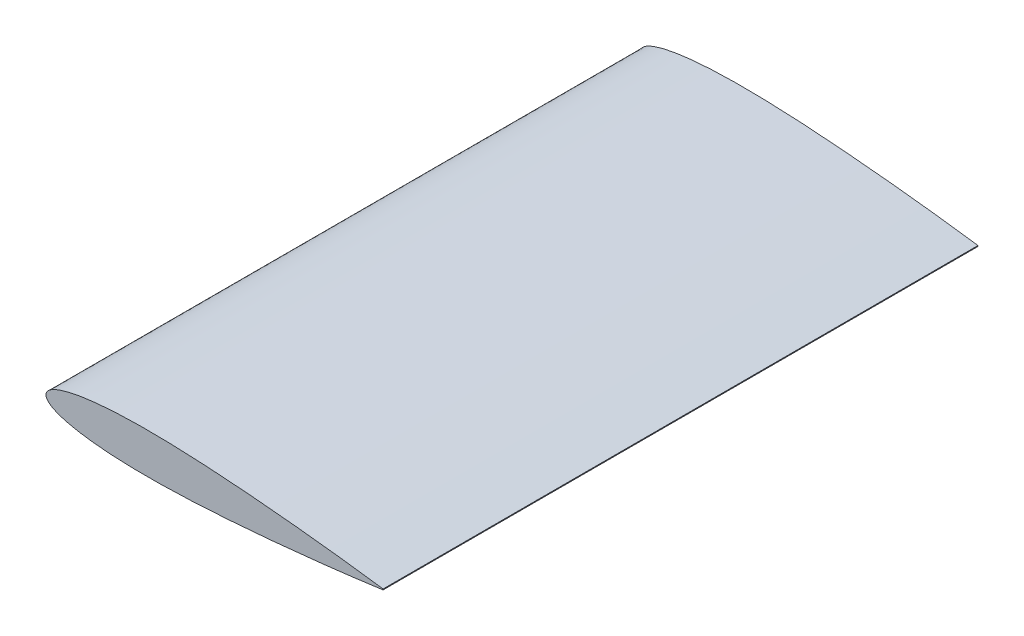
ISO-10303-21;
HEADER;
FILE_DESCRIPTION(('STEP AP214'),'2;1');
FILE_NAME('part.step','',(''),(''),'','','');
FILE_SCHEMA(('AUTOMOTIVE_DESIGN { 1 0 10303 214 1 1 1 1 }'));
ENDSEC;
DATA;
#1=APPLICATION_CONTEXT('core data for automotive mechanical design processes');
#2=APPLICATION_PROTOCOL_DEFINITION('international standard','automotive_design',2000,#1);
#3=PRODUCT_CONTEXT('',#1,'mechanical');
#4=PRODUCT('Part','Part','',(#3));
#5=PRODUCT_RELATED_PRODUCT_CATEGORY('part','',(#4));
#6=PRODUCT_DEFINITION_FORMATION('','',#4);
#7=PRODUCT_DEFINITION_CONTEXT('part definition',#1,'design');
#8=PRODUCT_DEFINITION('design','',#6,#7);
#9=PRODUCT_DEFINITION_SHAPE('','',#8);
#10=(LENGTH_UNIT() NAMED_UNIT(*) SI_UNIT(.MILLI.,.METRE.));
#11=(NAMED_UNIT(*) PLANE_ANGLE_UNIT() SI_UNIT($,.RADIAN.));
#12=(NAMED_UNIT(*) SI_UNIT($,.STERADIAN.) SOLID_ANGLE_UNIT());
#13=UNCERTAINTY_MEASURE_WITH_UNIT(LENGTH_MEASURE(1.E-05),#10,'distance_accuracy_value','');
#14=(GEOMETRIC_REPRESENTATION_CONTEXT(3) GLOBAL_UNCERTAINTY_ASSIGNED_CONTEXT((#13)) GLOBAL_UNIT_ASSIGNED_CONTEXT((#10,
#11,#12)) REPRESENTATION_CONTEXT('',''));
#15=CARTESIAN_POINT('',(0.,0.,0.));
#16=DIRECTION('',(0.,0.,1.));
#17=DIRECTION('',(1.,0.,0.));
#18=AXIS2_PLACEMENT_3D('',#15,#16,#17);
#19=CARTESIAN_POINT('',(170.,0.2142,300.));
#20=CARTESIAN_POINT('',(169.966913420147,0.218840619235661,300.));
#21=CARTESIAN_POINT('',(169.834646412693,0.237391972133654,300.));
#22=CARTESIAN_POINT('',(169.537333235811,0.279024136885221,300.));
#23=CARTESIAN_POINT('',(169.042585815151,0.348138554352047,300.));
#24=CARTESIAN_POINT('',(168.351556262011,0.444222957336236,300.));
#25=CARTESIAN_POINT('',(167.465861685236,0.566675287239761,300.));
#26=CARTESIAN_POINT('',(166.387568835462,0.714696441607183,300.));
#27=CARTESIAN_POINT('',(165.119197414714,0.887397870500569,300.));
#28=CARTESIAN_POINT('',(163.66370211281,1.0836228606394,300.));
#29=CARTESIAN_POINT('',(162.024490193658,1.30224457817312,300.));
#30=CARTESIAN_POINT('',(160.205382022448,1.54187674307822,300.));
#31=CARTESIAN_POINT('',(158.210634282203,1.80122503871419,300.));
#32=CARTESIAN_POINT('',(156.044893293559,2.07872888507132,300.));
#33=CARTESIAN_POINT('',(153.713221625527,2.3729269589396,300.));
#34=CARTESIAN_POINT('',(150.289057759426,2.79786100750127,300.));
#35=CARTESIAN_POINT('',(146.662395352833,3.23586388156133,300.));
#36=CARTESIAN_POINT('',(142.841697445813,3.68429155359345,300.));
#37=CARTESIAN_POINT('',(139.769351121291,4.03749985487666,300.));
#38=CARTESIAN_POINT('',(136.569100777601,4.39754966913632,300.));
#39=CARTESIAN_POINT('',(132.068788221899,4.892266007365,300.));
#40=CARTESIAN_POINT('',(127.422978072797,5.38437808735119,300.));
#41=CARTESIAN_POINT('',(121.375060843531,5.99962520341005,300.));
#42=CARTESIAN_POINT('',(116.361049701463,6.48721683459242,300.));
#43=CARTESIAN_POINT('',(111.246606257861,6.95999223865611,300.));
#44=CARTESIAN_POINT('',(107.313370290089,7.31009235845735,300.));
#45=CARTESIAN_POINT('',(103.328024651523,7.65034172210182,300.));
#46=CARTESIAN_POINT('',(99.2998704955034,7.97873272728442,300.));
#47=CARTESIAN_POINT('',(95.2383149477832,8.29305544558903,300.));
#48=CARTESIAN_POINT('',(91.1528461665571,8.59126885303062,300.));
#49=CARTESIAN_POINT('',(87.0530043628467,8.87108250883899,300.));
#50=CARTESIAN_POINT('',(82.9483581405088,9.13033403026924,300.));
#51=CARTESIAN_POINT('',(78.848497391655,9.36680388823235,300.));
#52=CARTESIAN_POINT('',(74.7629933750825,9.57831169154043,300.));
#53=CARTESIAN_POINT('',(70.7013796020843,9.76270103315663,300.));
#54=CARTESIAN_POINT('',(66.6731409162153,9.91791468222559,300.));
#55=CARTESIAN_POINT('',(62.6876820172122,10.0419020746302,300.));
#56=CARTESIAN_POINT('',(58.7543199679519,10.1329106926373,300.));
#57=CARTESIAN_POINT('',(54.8822262782405,10.1891815234078,300.));
#58=CARTESIAN_POINT('',(51.0804417260338,10.2091738851251,300.));
#59=CARTESIAN_POINT('',(47.357843857691,10.1916108640874,300.));
#60=CARTESIAN_POINT('',(43.7231248329136,10.1354465307096,300.));
#61=CARTESIAN_POINT('',(40.1847693392946,10.0397707688707,300.));
#62=CARTESIAN_POINT('',(36.7510318342402,9.90409832947464,300.));
#63=CARTESIAN_POINT('',(33.4299297563098,9.72814828419057,300.));
#64=CARTESIAN_POINT('',(30.2292184431396,9.51190517072201,300.));
#65=CARTESIAN_POINT('',(27.1563544648926,9.25570966136446,300.));
#66=CARTESIAN_POINT('',(24.2184930705753,8.96019337192182,300.));
#67=CARTESIAN_POINT('',(21.422491654562,8.62612442205964,300.));
#68=CARTESIAN_POINT('',(18.7748418673833,8.25474144749368,300.));
#69=CARTESIAN_POINT('',(16.2817086226514,7.84726037467767,300.));
#70=CARTESIAN_POINT('',(13.9488346964867,7.40540150509234,300.));
#71=CARTESIAN_POINT('',(11.7816274031335,6.93071855350701,300.));
#72=CARTESIAN_POINT('',(9.78501086408494,6.42520471549701,300.));
#73=CARTESIAN_POINT('',(7.96352359013566,5.89065784112295,300.));
#74=CARTESIAN_POINT('',(6.32116400595846,5.32912845603846,300.));
#75=CARTESIAN_POINT('',(4.86144051150193,4.74248133854955,300.));
#76=CARTESIAN_POINT('',(3.58725690528084,4.13245264091586,300.));
#77=CARTESIAN_POINT('',(2.50086033595376,3.50044118834844,300.));
#78=CARTESIAN_POINT('',(1.6038480633622,2.84716105892363,300.));
#79=CARTESIAN_POINT('',(0.897528539360109,2.17197733362747,300.));
#80=CARTESIAN_POINT('',(0.384178046410685,1.47253543236352,300.));
#81=CARTESIAN_POINT('',(0.0700363082935014,0.745784980408022,300.));
#82=CARTESIAN_POINT('',(-0.0341407787488203,0.,300.));
#83=CARTESIAN_POINT('',(0.0700363082935006,-0.745784980408021,300.));
#84=CARTESIAN_POINT('',(0.384178046410691,-1.47253543236354,300.));
#85=CARTESIAN_POINT('',(0.897528539360101,-2.17197733362746,300.));
#86=CARTESIAN_POINT('',(1.60384806336219,-2.84716105892363,300.));
#87=CARTESIAN_POINT('',(2.50086033595378,-3.50044118834845,300.));
#88=CARTESIAN_POINT('',(3.58725690528084,-4.13245264091585,300.));
#89=CARTESIAN_POINT('',(4.86144051150193,-4.74248133854956,300.));
#90=CARTESIAN_POINT('',(6.32116400595846,-5.32912845603846,300.));
#91=CARTESIAN_POINT('',(7.96352359013567,-5.89065784112295,300.));
#92=CARTESIAN_POINT('',(9.78501086408493,-6.42520471549701,300.));
#93=CARTESIAN_POINT('',(11.7816274031335,-6.93071855350701,300.));
#94=CARTESIAN_POINT('',(13.9488346964867,-7.40540150509234,300.));
#95=CARTESIAN_POINT('',(16.2817086226514,-7.84726037467768,300.));
#96=CARTESIAN_POINT('',(18.7748418673833,-8.25474144749368,300.));
#97=CARTESIAN_POINT('',(21.422491654562,-8.62612442205965,300.));
#98=CARTESIAN_POINT('',(24.2184930705753,-8.96019337192182,300.));
#99=CARTESIAN_POINT('',(27.1563544648926,-9.25570966136446,300.));
#100=CARTESIAN_POINT('',(30.2292184431396,-9.511905170722,300.));
#101=CARTESIAN_POINT('',(33.4299297563098,-9.72814828419057,300.));
#102=CARTESIAN_POINT('',(36.7510318342401,-9.90409832947464,300.));
#103=CARTESIAN_POINT('',(40.1847693392946,-10.0397707688707,300.));
#104=CARTESIAN_POINT('',(43.7231248329136,-10.1354465307096,300.));
#105=CARTESIAN_POINT('',(47.357843857691,-10.1916108640874,300.));
#106=CARTESIAN_POINT('',(51.0804417260338,-10.2091738851251,300.));
#107=CARTESIAN_POINT('',(54.8822262782404,-10.1891815234078,300.));
#108=CARTESIAN_POINT('',(58.7543199679519,-10.1329106926373,300.));
#109=CARTESIAN_POINT('',(62.6876820172122,-10.0419020746302,300.));
#110=CARTESIAN_POINT('',(66.6731409162153,-9.91791468222559,300.));
#111=CARTESIAN_POINT('',(70.7013796020843,-9.76270103315664,300.));
#112=CARTESIAN_POINT('',(74.7629933750825,-9.57831169154043,300.));
#113=CARTESIAN_POINT('',(78.8484973916549,-9.36680388823235,300.));
#114=CARTESIAN_POINT('',(82.9483581405089,-9.13033403026925,300.));
#115=CARTESIAN_POINT('',(87.0530043628467,-8.87108250883899,300.));
#116=CARTESIAN_POINT('',(91.152846166557,-8.59126885303062,300.));
#117=CARTESIAN_POINT('',(95.2383149477833,-8.29305544558903,300.));
#118=CARTESIAN_POINT('',(99.2998704955034,-7.97873272728442,300.));
#119=CARTESIAN_POINT('',(103.328024651523,-7.65034172210182,300.));
#120=CARTESIAN_POINT('',(107.313370290089,-7.31009235845734,300.));
#121=CARTESIAN_POINT('',(111.246606257861,-6.95999223865612,300.));
#122=CARTESIAN_POINT('',(116.361049701463,-6.48721683459241,300.));
#123=CARTESIAN_POINT('',(121.375060843531,-5.99962520341006,300.));
#124=CARTESIAN_POINT('',(127.422978072797,-5.38437808735119,300.));
#125=CARTESIAN_POINT('',(132.068788221899,-4.892266007365,300.));
#126=CARTESIAN_POINT('',(136.569100777601,-4.39754966913632,300.));
#127=CARTESIAN_POINT('',(139.769351121291,-4.03749985487667,300.));
#128=CARTESIAN_POINT('',(143.774710008,-3.57702897725704,300.));
#129=CARTESIAN_POINT('',(147.594917999963,-3.12438290020218,300.));
#130=CARTESIAN_POINT('',(151.22106625754,-2.68220002868011,300.));
#131=CARTESIAN_POINT('',(153.713221625526,-2.3729269589396,300.));
#132=CARTESIAN_POINT('',(156.044893293559,-2.07872888507132,300.));
#133=CARTESIAN_POINT('',(158.210634282203,-1.80122503871418,300.));
#134=CARTESIAN_POINT('',(160.205382022448,-1.54187674307822,300.));
#135=CARTESIAN_POINT('',(162.024490193658,-1.30224457817312,300.));
#136=CARTESIAN_POINT('',(163.66370211281,-1.0836228606394,300.));
#137=CARTESIAN_POINT('',(165.119197414714,-0.887397870500566,300.));
#138=CARTESIAN_POINT('',(166.387568835462,-0.714696441607186,300.));
#139=CARTESIAN_POINT('',(167.465861685236,-0.566675287239758,300.));
#140=CARTESIAN_POINT('',(168.351556262011,-0.444222957336238,300.));
#141=CARTESIAN_POINT('',(169.042585815151,-0.348138554352049,300.));
#142=CARTESIAN_POINT('',(169.537333235811,-0.279024136885216,300.));
#143=CARTESIAN_POINT('',(169.834646412693,-0.237391972133655,300.));
#144=CARTESIAN_POINT('',(169.966913420147,-0.218840619235661,300.));
#145=CARTESIAN_POINT('',(170.,-0.2142,300.));
#146=B_SPLINE_CURVE_WITH_KNOTS('',3,(#19,#20,#21,#22,#23,#24,#25,#26,#27,#28,#29,#30,#31,#32,
#33,#34,#35,#36,#37,#38,#39,#40,#41,#42,#43,#44,#45,#46,#47,#48,#49,#50,#51,#52,#53,#54,#55,#56,
#57,#58,#59,#60,#61,#62,#63,#64,#65,#66,#67,#68,#69,#70,#71,#72,#73,#74,#75,#76,#77,#78,#79,#80,
#81,#82,#83,#84,#85,#86,#87,#88,#89,#90,#91,#92,#93,#94,#95,#96,#97,#98,#99,#100,#101,#102,#103,
#104,#105,#106,#107,#108,#109,#110,#111,#112,#113,#114,#115,#116,#117,#118,#119,#120,#121,#122,
#123,#124,#125,#126,#127,#128,#129,#130,#131,#132,#133,#134,#135,#136,#137,#138,#139,#140,#141,
#142,#143,#144,#145),.UNSPECIFIED.,.F.,.F.,(4,1,1,1,1,1,1,1,1,1,1,1,1,1,1,1,1,1,1,1,1,1,1,1,1,1,
1,1,1,1,1,1,1,1,1,1,1,1,1,1,1,1,1,1,1,1,1,1,1,1,1,1,1,1,1,1,1,1,1,1,1,1,1,1,1,1,1,1,1,1,1,1,1,1,
1,1,1,1,1,1,1,1,1,1,1,1,1,1,1,1,1,1,1,1,1,1,1,1,1,1,1,1,1,1,1,1,1,1,1,1,1,1,1,1,1,1,1,1,1,1,1,1,
1,1,4),(0.,0.000289136239464251,0.00115585186836303,0.00259807176574666,0.00461229074804752,
0.00719360233789546,0.0103358425433033,0.0140314234174302,0.0182714578762678,0.0230457505507878,
0.0283428825481301,0.0341501438094279,0.0404537215260809,0.0472385777998561,0.0544885674435659,
0.0703139628271989,0.0788519515516417,0.0877800820667701,0.0970773651812827,0.106721842165646,
0.126960673136058,0.137507300270649,0.159330994759336,0.170556743984215,0.181956674107833,
0.193504000435237,0.205171592358548,0.216932161315691,0.228757981093744,0.240621468431354,
0.252494876350748,0.264350495664049,0.276160727816135,0.287898242271434,0.299535933535089,
0.311046960926537,0.322405029982323,0.333584246553175,0.344559423833966,0.355305887726215,
0.365799654110184,0.376017640591634,0.385937520098884,0.395537817559628,0.404798062580561,
0.413698788674877,0.422221673371119,0.430349466588267,0.438066139084597,0.445357152843043,
0.452209429218047,0.458611496014274,0.464554007287197,0.470029929341412,0.475035083249316,
0.479569167936556,0.483636908883566,0.487250212152871,0.490431500358975,0.493218829923286,
0.495674080971937,0.49789123316147,0.5,0.50210876683853,0.504325919028063,0.506781170076714,
0.509568499641026,0.512749787847129,0.516363091116434,0.520430832063445,0.524964916750684,
0.529970070658588,0.535445992712804,0.541388503985727,0.547790570781953,0.554642847156957,
0.561933860915403,0.569650533411733,0.577778326628881,0.586301211325123,0.59520193741944,
0.604462182440372,0.614062479901116,0.623982359408366,0.634200345889816,0.644694112273785,
0.655440576166035,0.666415753446825,0.677594970017677,0.688953039073463,0.700464066464911,
0.712101757728566,0.723839272183865,0.735649504335951,0.747505123649252,0.759378531568646,
0.771242018906256,0.783067838684309,0.794828407641452,0.806495999564764,0.818043325892167,
0.829443256015785,0.840669005240664,0.862492699729351,0.873039326863942,0.893278157834354,
0.902922634818717,0.91221991793323,0.921148048448358,0.937813568370674,0.945511432556434,
0.952761422200144,0.959546278473919,0.965849856190572,0.97165711745187,0.976954249449212,
0.981728542123732,0.98596857658257,0.989664157456697,0.992806397662105,0.995387709251953,
0.997401928234253,0.998844148131637,0.999710863760536,1.),.UNSPECIFIED.);
#147=DIRECTION('',(0.,0.,-1.));
#148=VECTOR('',#147,1.);
#149=SURFACE_OF_LINEAR_EXTRUSION('',#146,#148);
#150=CARTESIAN_POINT('',(170.,0.2142,0.));
#151=CARTESIAN_POINT('',(169.966913420147,0.218840619235661,0.));
#152=CARTESIAN_POINT('',(169.834646412693,0.237391972133654,0.));
#153=CARTESIAN_POINT('',(169.537333235811,0.279024136885221,0.));
#154=CARTESIAN_POINT('',(169.042585815151,0.348138554352047,0.));
#155=CARTESIAN_POINT('',(168.351556262011,0.444222957336236,0.));
#156=CARTESIAN_POINT('',(167.465861685236,0.566675287239761,0.));
#157=CARTESIAN_POINT('',(166.387568835462,0.714696441607183,0.));
#158=CARTESIAN_POINT('',(165.119197414714,0.887397870500569,0.));
#159=CARTESIAN_POINT('',(163.66370211281,1.0836228606394,0.));
#160=CARTESIAN_POINT('',(162.024490193658,1.30224457817312,0.));
#161=CARTESIAN_POINT('',(160.205382022448,1.54187674307822,0.));
#162=CARTESIAN_POINT('',(158.210634282203,1.80122503871419,0.));
#163=CARTESIAN_POINT('',(156.044893293559,2.07872888507132,0.));
#164=CARTESIAN_POINT('',(153.713221625527,2.3729269589396,0.));
#165=CARTESIAN_POINT('',(150.289057759426,2.79786100750127,0.));
#166=CARTESIAN_POINT('',(146.662395352833,3.23586388156133,0.));
#167=CARTESIAN_POINT('',(142.841697445813,3.68429155359345,0.));
#168=CARTESIAN_POINT('',(139.769351121291,4.03749985487666,0.));
#169=CARTESIAN_POINT('',(136.569100777601,4.39754966913632,0.));
#170=CARTESIAN_POINT('',(132.068788221899,4.892266007365,0.));
#171=CARTESIAN_POINT('',(127.422978072797,5.38437808735119,0.));
#172=CARTESIAN_POINT('',(121.375060843531,5.99962520341005,0.));
#173=CARTESIAN_POINT('',(116.361049701463,6.48721683459242,0.));
#174=CARTESIAN_POINT('',(111.246606257861,6.95999223865611,0.));
#175=CARTESIAN_POINT('',(107.313370290089,7.31009235845735,0.));
#176=CARTESIAN_POINT('',(103.328024651523,7.65034172210182,0.));
#177=CARTESIAN_POINT('',(99.2998704955034,7.97873272728442,0.));
#178=CARTESIAN_POINT('',(95.2383149477832,8.29305544558903,0.));
#179=CARTESIAN_POINT('',(91.1528461665571,8.59126885303062,0.));
#180=CARTESIAN_POINT('',(87.0530043628467,8.87108250883899,0.));
#181=CARTESIAN_POINT('',(82.9483581405088,9.13033403026924,0.));
#182=CARTESIAN_POINT('',(78.848497391655,9.36680388823235,0.));
#183=CARTESIAN_POINT('',(74.7629933750825,9.57831169154043,0.));
#184=CARTESIAN_POINT('',(70.7013796020843,9.76270103315663,0.));
#185=CARTESIAN_POINT('',(66.6731409162153,9.91791468222559,0.));
#186=CARTESIAN_POINT('',(62.6876820172122,10.0419020746302,0.));
#187=CARTESIAN_POINT('',(58.7543199679519,10.1329106926373,0.));
#188=CARTESIAN_POINT('',(54.8822262782405,10.1891815234078,0.));
#189=CARTESIAN_POINT('',(51.0804417260338,10.2091738851251,0.));
#190=CARTESIAN_POINT('',(47.357843857691,10.1916108640874,0.));
#191=CARTESIAN_POINT('',(43.7231248329136,10.1354465307096,0.));
#192=CARTESIAN_POINT('',(40.1847693392946,10.0397707688707,0.));
#193=CARTESIAN_POINT('',(36.7510318342402,9.90409832947464,0.));
#194=CARTESIAN_POINT('',(33.4299297563098,9.72814828419057,0.));
#195=CARTESIAN_POINT('',(30.2292184431396,9.51190517072201,0.));
#196=CARTESIAN_POINT('',(27.1563544648926,9.25570966136446,0.));
#197=CARTESIAN_POINT('',(24.2184930705753,8.96019337192182,0.));
#198=CARTESIAN_POINT('',(21.422491654562,8.62612442205964,0.));
#199=CARTESIAN_POINT('',(18.7748418673833,8.25474144749368,0.));
#200=CARTESIAN_POINT('',(16.2817086226514,7.84726037467767,0.));
#201=CARTESIAN_POINT('',(13.9488346964867,7.40540150509234,0.));
#202=CARTESIAN_POINT('',(11.7816274031335,6.93071855350701,0.));
#203=CARTESIAN_POINT('',(9.78501086408494,6.42520471549701,0.));
#204=CARTESIAN_POINT('',(7.96352359013566,5.89065784112295,0.));
#205=CARTESIAN_POINT('',(6.32116400595846,5.32912845603846,0.));
#206=CARTESIAN_POINT('',(4.86144051150193,4.74248133854955,0.));
#207=CARTESIAN_POINT('',(3.58725690528084,4.13245264091586,0.));
#208=CARTESIAN_POINT('',(2.50086033595376,3.50044118834844,0.));
#209=CARTESIAN_POINT('',(1.6038480633622,2.84716105892363,0.));
#210=CARTESIAN_POINT('',(0.897528539360109,2.17197733362747,0.));
#211=CARTESIAN_POINT('',(0.384178046410685,1.47253543236352,0.));
#212=CARTESIAN_POINT('',(0.0700363082935014,0.745784980408022,0.));
#213=CARTESIAN_POINT('',(-0.0341407787488203,0.,0.));
#214=CARTESIAN_POINT('',(0.0700363082935006,-0.745784980408021,0.));
#215=CARTESIAN_POINT('',(0.384178046410691,-1.47253543236354,0.));
#216=CARTESIAN_POINT('',(0.897528539360101,-2.17197733362746,0.));
#217=CARTESIAN_POINT('',(1.60384806336219,-2.84716105892363,0.));
#218=CARTESIAN_POINT('',(2.50086033595378,-3.50044118834845,0.));
#219=CARTESIAN_POINT('',(3.58725690528084,-4.13245264091585,0.));
#220=CARTESIAN_POINT('',(4.86144051150193,-4.74248133854956,0.));
#221=CARTESIAN_POINT('',(6.32116400595846,-5.32912845603846,0.));
#222=CARTESIAN_POINT('',(7.96352359013567,-5.89065784112295,0.));
#223=CARTESIAN_POINT('',(9.78501086408493,-6.42520471549701,0.));
#224=CARTESIAN_POINT('',(11.7816274031335,-6.93071855350701,0.));
#225=CARTESIAN_POINT('',(13.9488346964867,-7.40540150509234,0.));
#226=CARTESIAN_POINT('',(16.2817086226514,-7.84726037467768,0.));
#227=CARTESIAN_POINT('',(18.7748418673833,-8.25474144749368,0.));
#228=CARTESIAN_POINT('',(21.422491654562,-8.62612442205965,0.));
#229=CARTESIAN_POINT('',(24.2184930705753,-8.96019337192182,0.));
#230=CARTESIAN_POINT('',(27.1563544648926,-9.25570966136446,0.));
#231=CARTESIAN_POINT('',(30.2292184431396,-9.511905170722,0.));
#232=CARTESIAN_POINT('',(33.4299297563098,-9.72814828419057,0.));
#233=CARTESIAN_POINT('',(36.7510318342401,-9.90409832947464,0.));
#234=CARTESIAN_POINT('',(40.1847693392946,-10.0397707688707,0.));
#235=CARTESIAN_POINT('',(43.7231248329136,-10.1354465307096,0.));
#236=CARTESIAN_POINT('',(47.357843857691,-10.1916108640874,0.));
#237=CARTESIAN_POINT('',(51.0804417260338,-10.2091738851251,0.));
#238=CARTESIAN_POINT('',(54.8822262782404,-10.1891815234078,0.));
#239=CARTESIAN_POINT('',(58.7543199679519,-10.1329106926373,0.));
#240=CARTESIAN_POINT('',(62.6876820172122,-10.0419020746302,0.));
#241=CARTESIAN_POINT('',(66.6731409162153,-9.91791468222559,0.));
#242=CARTESIAN_POINT('',(70.7013796020843,-9.76270103315664,0.));
#243=CARTESIAN_POINT('',(74.7629933750825,-9.57831169154043,0.));
#244=CARTESIAN_POINT('',(78.8484973916549,-9.36680388823235,0.));
#245=CARTESIAN_POINT('',(82.9483581405089,-9.13033403026925,0.));
#246=CARTESIAN_POINT('',(87.0530043628467,-8.87108250883899,0.));
#247=CARTESIAN_POINT('',(91.152846166557,-8.59126885303062,0.));
#248=CARTESIAN_POINT('',(95.2383149477833,-8.29305544558903,0.));
#249=CARTESIAN_POINT('',(99.2998704955034,-7.97873272728442,0.));
#250=CARTESIAN_POINT('',(103.328024651523,-7.65034172210182,0.));
#251=CARTESIAN_POINT('',(107.313370290089,-7.31009235845734,0.));
#252=CARTESIAN_POINT('',(111.246606257861,-6.95999223865612,0.));
#253=CARTESIAN_POINT('',(116.361049701463,-6.48721683459241,0.));
#254=CARTESIAN_POINT('',(121.375060843531,-5.99962520341006,0.));
#255=CARTESIAN_POINT('',(127.422978072797,-5.38437808735119,0.));
#256=CARTESIAN_POINT('',(132.068788221899,-4.892266007365,0.));
#257=CARTESIAN_POINT('',(136.569100777601,-4.39754966913632,0.));
#258=CARTESIAN_POINT('',(139.769351121291,-4.03749985487667,0.));
#259=CARTESIAN_POINT('',(143.774710008,-3.57702897725704,0.));
#260=CARTESIAN_POINT('',(147.594917999963,-3.12438290020218,0.));
#261=CARTESIAN_POINT('',(151.22106625754,-2.68220002868011,0.));
#262=CARTESIAN_POINT('',(153.713221625526,-2.3729269589396,0.));
#263=CARTESIAN_POINT('',(156.044893293559,-2.07872888507132,0.));
#264=CARTESIAN_POINT('',(158.210634282203,-1.80122503871418,0.));
#265=CARTESIAN_POINT('',(160.205382022448,-1.54187674307822,0.));
#266=CARTESIAN_POINT('',(162.024490193658,-1.30224457817312,0.));
#267=CARTESIAN_POINT('',(163.66370211281,-1.0836228606394,0.));
#268=CARTESIAN_POINT('',(165.119197414714,-0.887397870500566,0.));
#269=CARTESIAN_POINT('',(166.387568835462,-0.714696441607186,0.));
#270=CARTESIAN_POINT('',(167.465861685236,-0.566675287239758,0.));
#271=CARTESIAN_POINT('',(168.351556262011,-0.444222957336238,0.));
#272=CARTESIAN_POINT('',(169.042585815151,-0.348138554352049,0.));
#273=CARTESIAN_POINT('',(169.537333235811,-0.279024136885216,0.));
#274=CARTESIAN_POINT('',(169.834646412693,-0.237391972133655,0.));
#275=CARTESIAN_POINT('',(169.966913420147,-0.218840619235661,0.));
#276=CARTESIAN_POINT('',(170.,-0.2142,0.));
#277=B_SPLINE_CURVE_WITH_KNOTS('',3,(#150,#151,#152,#153,#154,#155,#156,#157,#158,#159,#160,
#161,#162,#163,#164,#165,#166,#167,#168,#169,#170,#171,#172,#173,#174,#175,#176,#177,#178,#179,
#180,#181,#182,#183,#184,#185,#186,#187,#188,#189,#190,#191,#192,#193,#194,#195,#196,#197,#198,
#199,#200,#201,#202,#203,#204,#205,#206,#207,#208,#209,#210,#211,#212,#213,#214,#215,#216,#217,
#218,#219,#220,#221,#222,#223,#224,#225,#226,#227,#228,#229,#230,#231,#232,#233,#234,#235,#236,
#237,#238,#239,#240,#241,#242,#243,#244,#245,#246,#247,#248,#249,#250,#251,#252,#253,#254,#255,
#256,#257,#258,#259,#260,#261,#262,#263,#264,#265,#266,#267,#268,#269,#270,#271,#272,#273,#274,
#275,#276),.UNSPECIFIED.,.F.,.F.,(4,1,1,1,1,1,1,1,1,1,1,1,1,1,1,1,1,1,1,1,1,1,1,1,1,1,1,1,1,1,1,
1,1,1,1,1,1,1,1,1,1,1,1,1,1,1,1,1,1,1,1,1,1,1,1,1,1,1,1,1,1,1,1,1,1,1,1,1,1,1,1,1,1,1,1,1,1,1,1,
1,1,1,1,1,1,1,1,1,1,1,1,1,1,1,1,1,1,1,1,1,1,1,1,1,1,1,1,1,1,1,1,1,1,1,1,1,1,1,1,1,1,1,1,1,4),
(0.,0.000289136239464251,0.00115585186836303,0.00259807176574666,0.00461229074804752,
0.00719360233789546,0.0103358425433033,0.0140314234174302,0.0182714578762678,0.0230457505507878,
0.0283428825481301,0.0341501438094279,0.0404537215260809,0.0472385777998561,0.0544885674435659,
0.0703139628271989,0.0788519515516417,0.0877800820667701,0.0970773651812827,0.106721842165646,
0.126960673136058,0.137507300270649,0.159330994759336,0.170556743984215,0.181956674107833,
0.193504000435237,0.205171592358548,0.216932161315691,0.228757981093744,0.240621468431354,
0.252494876350748,0.264350495664049,0.276160727816135,0.287898242271434,0.299535933535089,
0.311046960926537,0.322405029982323,0.333584246553175,0.344559423833966,0.355305887726215,
0.365799654110184,0.376017640591634,0.385937520098884,0.395537817559628,0.404798062580561,
0.413698788674877,0.422221673371119,0.430349466588267,0.438066139084597,0.445357152843043,
0.452209429218047,0.458611496014274,0.464554007287197,0.470029929341412,0.475035083249316,
0.479569167936556,0.483636908883566,0.487250212152871,0.490431500358975,0.493218829923286,
0.495674080971937,0.49789123316147,0.5,0.50210876683853,0.504325919028063,0.506781170076714,
0.509568499641026,0.512749787847129,0.516363091116434,0.520430832063445,0.524964916750684,
0.529970070658588,0.535445992712804,0.541388503985727,0.547790570781953,0.554642847156957,
0.561933860915403,0.569650533411733,0.577778326628881,0.586301211325123,0.59520193741944,
0.604462182440372,0.614062479901116,0.623982359408366,0.634200345889816,0.644694112273785,
0.655440576166035,0.666415753446825,0.677594970017677,0.688953039073463,0.700464066464911,
0.712101757728566,0.723839272183865,0.735649504335951,0.747505123649252,0.759378531568646,
0.771242018906256,0.783067838684309,0.794828407641452,0.806495999564764,0.818043325892167,
0.829443256015785,0.840669005240664,0.862492699729351,0.873039326863942,0.893278157834354,
0.902922634818717,0.91221991793323,0.921148048448358,0.937813568370674,0.945511432556434,
0.952761422200144,0.959546278473919,0.965849856190572,0.97165711745187,0.976954249449212,
0.981728542123732,0.98596857658257,0.989664157456697,0.992806397662105,0.995387709251953,
0.997401928234253,0.998844148131637,0.999710863760536,1.),.UNSPECIFIED.);
#278=CARTESIAN_POINT('',(170.,0.2142,0.));
#279=VERTEX_POINT('',#278);
#280=CARTESIAN_POINT('',(170.,-0.2142,0.));
#281=VERTEX_POINT('',#280);
#282=EDGE_CURVE('E75',#279,#281,#277,.T.);
#283=ORIENTED_EDGE('',*,*,#282,.T.);
#284=DIRECTION('',(0.,0.,-1.));
#285=VECTOR('',#284,1.);
#286=CARTESIAN_POINT('',(170.,-0.2142,300.));
#287=LINE('',#286,#285);
#288=CARTESIAN_POINT('',(170.,-0.2142,300.));
#289=VERTEX_POINT('',#288);
#290=EDGE_CURVE('E11',#289,#281,#287,.T.);
#291=ORIENTED_EDGE('',*,*,#290,.F.);
#292=CARTESIAN_POINT('',(170.,0.2142,300.));
#293=VERTEX_POINT('',#292);
#294=EDGE_CURVE('E74',#293,#289,#146,.T.);
#295=ORIENTED_EDGE('',*,*,#294,.F.);
#296=DIRECTION('',(0.,0.,-1.));
#297=VECTOR('',#296,1.);
#298=CARTESIAN_POINT('',(170.,0.2142,300.));
#299=LINE('',#298,#297);
#300=EDGE_CURVE('E51',#293,#279,#299,.T.);
#301=ORIENTED_EDGE('',*,*,#300,.T.);
#302=EDGE_LOOP('',(#283,#291,#295,#301));
#303=FACE_BOUND('',#302,.T.);
#304=ADVANCED_FACE('F41',(#303),#149,.F.);
#305=CARTESIAN_POINT('',(170.,0.2142,300.));
#306=DIRECTION('',(-1.,0.,0.));
#307=DIRECTION('',(0.,0.,1.));
#308=AXIS2_PLACEMENT_3D('',#305,#306,#307);
#309=PLANE('',#308);
#310=DIRECTION('',(0.,1.,0.));
#311=VECTOR('',#310,1.);
#312=CARTESIAN_POINT('',(170.,0.2142,0.));
#313=LINE('',#312,#311);
#314=EDGE_CURVE('E66',#281,#279,#313,.T.);
#315=ORIENTED_EDGE('',*,*,#314,.T.);
#316=ORIENTED_EDGE('',*,*,#300,.F.);
#317=DIRECTION('',(0.,1.,0.));
#318=VECTOR('',#317,1.);
#319=CARTESIAN_POINT('',(170.,0.2142,300.));
#320=LINE('',#319,#318);
#321=EDGE_CURVE('E58',#289,#293,#320,.T.);
#322=ORIENTED_EDGE('',*,*,#321,.F.);
#323=ORIENTED_EDGE('',*,*,#290,.T.);
#324=EDGE_LOOP('',(#315,#316,#322,#323));
#325=FACE_BOUND('',#324,.T.);
#326=ADVANCED_FACE('F69',(#325),#309,.F.);
#327=CARTESIAN_POINT('',(0.,0.,300.));
#328=DIRECTION('',(0.,0.,-1.));
#329=DIRECTION('',(-1.,0.,0.));
#330=AXIS2_PLACEMENT_3D('',#327,#328,#329);
#331=PLANE('',#330);
#332=ORIENTED_EDGE('',*,*,#294,.T.);
#333=ORIENTED_EDGE('',*,*,#321,.T.);
#334=EDGE_LOOP('',(#332,#333));
#335=FACE_BOUND('',#334,.T.);
#336=ADVANCED_FACE('F96',(#335),#331,.F.);
#337=CARTESIAN_POINT('',(0.,0.,0.));
#338=DIRECTION('',(0.,0.,-1.));
#339=DIRECTION('',(-1.,0.,0.));
#340=AXIS2_PLACEMENT_3D('',#337,#338,#339);
#341=PLANE('',#340);
#342=ORIENTED_EDGE('',*,*,#282,.F.);
#343=ORIENTED_EDGE('',*,*,#314,.F.);
#344=EDGE_LOOP('',(#342,#343));
#345=FACE_BOUND('',#344,.T.);
#346=ADVANCED_FACE('F79',(#345),#341,.T.);
#347=CLOSED_SHELL('',(#304,#326,#336,#346));
#348=MANIFOLD_SOLID_BREP('B2',#347);
#349=ADVANCED_BREP_SHAPE_REPRESENTATION('',(#18,#348),#14);
#350=SHAPE_DEFINITION_REPRESENTATION(#9,#349);
ENDSEC;
END-ISO-10303-21;
